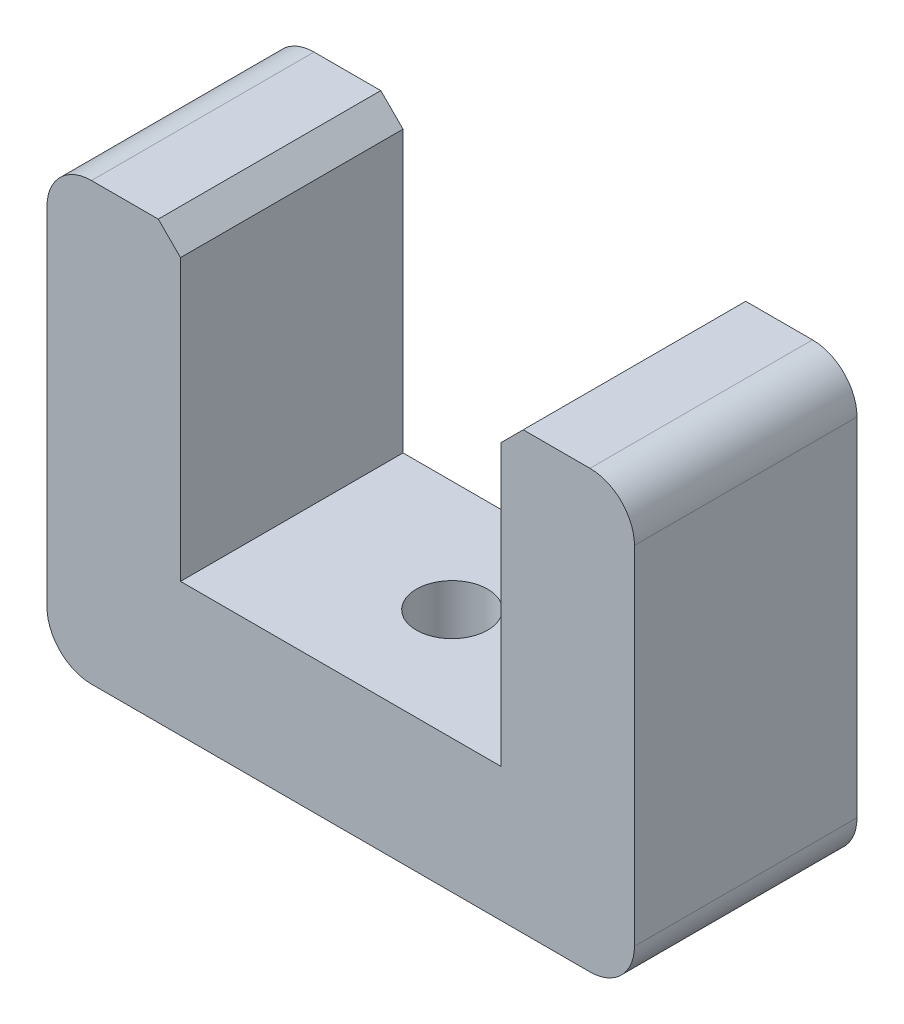
ISO-10303-21;
HEADER;
FILE_DESCRIPTION(('STEP AP214'),'2;1');
FILE_NAME('part.step','',(''),(''),'','','');
FILE_SCHEMA(('AUTOMOTIVE_DESIGN { 1 0 10303 214 1 1 1 1 }'));
ENDSEC;
DATA;
#1=APPLICATION_CONTEXT('core data for automotive mechanical design processes');
#2=APPLICATION_PROTOCOL_DEFINITION('international standard','automotive_design',2000,#1);
#3=PRODUCT_CONTEXT('',#1,'mechanical');
#4=PRODUCT('Part','Part','',(#3));
#5=PRODUCT_RELATED_PRODUCT_CATEGORY('part','',(#4));
#6=PRODUCT_DEFINITION_FORMATION('','',#4);
#7=PRODUCT_DEFINITION_CONTEXT('part definition',#1,'design');
#8=PRODUCT_DEFINITION('design','',#6,#7);
#9=PRODUCT_DEFINITION_SHAPE('','',#8);
#10=(LENGTH_UNIT() NAMED_UNIT(*) SI_UNIT(.MILLI.,.METRE.));
#11=(NAMED_UNIT(*) PLANE_ANGLE_UNIT() SI_UNIT($,.RADIAN.));
#12=(NAMED_UNIT(*) SI_UNIT($,.STERADIAN.) SOLID_ANGLE_UNIT());
#13=UNCERTAINTY_MEASURE_WITH_UNIT(LENGTH_MEASURE(1.E-05),#10,'distance_accuracy_value','');
#14=(GEOMETRIC_REPRESENTATION_CONTEXT(3) GLOBAL_UNCERTAINTY_ASSIGNED_CONTEXT((#13)) GLOBAL_UNIT_ASSIGNED_CONTEXT((#10,
#11,#12)) REPRESENTATION_CONTEXT('',''));
#15=CARTESIAN_POINT('',(0.,0.,0.));
#16=DIRECTION('',(0.,0.,1.));
#17=DIRECTION('',(1.,0.,0.));
#18=AXIS2_PLACEMENT_3D('',#15,#16,#17);
#19=CARTESIAN_POINT('',(-3.6,0.,5.));
#20=DIRECTION('',(0.,-1.,0.));
#21=DIRECTION('',(1.,0.,0.));
#22=AXIS2_PLACEMENT_3D('',#19,#20,#21);
#23=PLANE('',#22);
#24=DIRECTION('',(-1.,0.,0.));
#25=VECTOR('',#24,1.);
#26=CARTESIAN_POINT('',(-3.6,0.,0.));
#27=LINE('',#26,#25);
#28=CARTESIAN_POINT('',(-4.1,0.,0.));
#29=VERTEX_POINT('',#28);
#30=CARTESIAN_POINT('',(-5.6,0.,0.));
#31=VERTEX_POINT('',#30);
#32=EDGE_CURVE('E168',#29,#31,#27,.T.);
#33=ORIENTED_EDGE('',*,*,#32,.T.);
#34=DIRECTION('',(0.,0.,-1.));
#35=VECTOR('',#34,1.);
#36=CARTESIAN_POINT('',(-5.6,0.,5.));
#37=LINE('',#36,#35);
#38=CARTESIAN_POINT('',(-5.6,0.,5.));
#39=VERTEX_POINT('',#38);
#40=EDGE_CURVE('E42',#31,#39,#37,.F.);
#41=ORIENTED_EDGE('',*,*,#40,.T.);
#42=DIRECTION('',(-1.,0.,0.));
#43=VECTOR('',#42,1.);
#44=CARTESIAN_POINT('',(-3.6,0.,5.));
#45=LINE('',#44,#43);
#46=CARTESIAN_POINT('',(-4.1,0.,5.));
#47=VERTEX_POINT('',#46);
#48=EDGE_CURVE('E188',#47,#39,#45,.T.);
#49=ORIENTED_EDGE('',*,*,#48,.F.);
#50=DIRECTION('',(0.,0.,-1.));
#51=VECTOR('',#50,1.);
#52=CARTESIAN_POINT('',(-4.1,0.,5.));
#53=LINE('',#52,#51);
#54=EDGE_CURVE('E157',#47,#29,#53,.T.);
#55=ORIENTED_EDGE('',*,*,#54,.T.);
#56=EDGE_LOOP('',(#33,#41,#49,#55));
#57=FACE_BOUND('',#56,.T.);
#58=ADVANCED_FACE('F34',(#57),#23,.F.);
#59=CARTESIAN_POINT('',(-6.6,0.,5.));
#60=DIRECTION('',(1.,0.,0.));
#61=DIRECTION('',(0.,1.,0.));
#62=AXIS2_PLACEMENT_3D('',#59,#60,#61);
#63=PLANE('',#62);
#64=DIRECTION('',(0.,-1.,0.));
#65=VECTOR('',#64,1.);
#66=CARTESIAN_POINT('',(-6.6,0.,0.));
#67=LINE('',#66,#65);
#68=CARTESIAN_POINT('',(-6.6,-1.,0.));
#69=VERTEX_POINT('',#68);
#70=CARTESIAN_POINT('',(-6.6,-8.8,0.));
#71=VERTEX_POINT('',#70);
#72=EDGE_CURVE('E171',#69,#71,#67,.T.);
#73=ORIENTED_EDGE('',*,*,#72,.T.);
#74=DIRECTION('',(0.,0.,-1.));
#75=VECTOR('',#74,1.);
#76=CARTESIAN_POINT('',(-6.6,-8.8,5.));
#77=LINE('',#76,#75);
#78=CARTESIAN_POINT('',(-6.6,-8.8,5.));
#79=VERTEX_POINT('',#78);
#80=EDGE_CURVE('E223',#71,#79,#77,.F.);
#81=ORIENTED_EDGE('',*,*,#80,.T.);
#82=DIRECTION('',(0.,-1.,0.));
#83=VECTOR('',#82,1.);
#84=CARTESIAN_POINT('',(-6.6,0.,5.));
#85=LINE('',#84,#83);
#86=CARTESIAN_POINT('',(-6.6,-1.,5.));
#87=VERTEX_POINT('',#86);
#88=EDGE_CURVE('E245',#87,#79,#85,.T.);
#89=ORIENTED_EDGE('',*,*,#88,.F.);
#90=DIRECTION('',(0.,0.,-1.));
#91=VECTOR('',#90,1.);
#92=CARTESIAN_POINT('',(-6.6,-1.,5.));
#93=LINE('',#92,#91);
#94=EDGE_CURVE('E220',#87,#69,#93,.T.);
#95=ORIENTED_EDGE('',*,*,#94,.T.);
#96=EDGE_LOOP('',(#73,#81,#89,#95));
#97=FACE_BOUND('',#96,.T.);
#98=ADVANCED_FACE('F251',(#97),#63,.F.);
#99=CARTESIAN_POINT('',(-6.6,-9.8,5.));
#100=DIRECTION('',(0.,1.,0.));
#101=DIRECTION('',(-1.,0.,0.));
#102=AXIS2_PLACEMENT_3D('',#99,#100,#101);
#103=PLANE('',#102);
#104=CARTESIAN_POINT('',(0.,-9.8,2.5));
#105=DIRECTION('',(0.,1.,0.));
#106=DIRECTION('',(-1.,0.,0.));
#107=AXIS2_PLACEMENT_3D('',#104,#105,#106);
#108=CIRCLE('',#107,0.8);
#109=CARTESIAN_POINT('',(-0.799999999999999,-9.8,2.5));
#110=VERTEX_POINT('',#109);
#111=EDGE_CURVE('E172',#110,#110,#108,.T.);
#112=ORIENTED_EDGE('',*,*,#111,.T.);
#113=EDGE_LOOP('',(#112));
#114=FACE_BOUND('',#113,.T.);
#115=DIRECTION('',(1.,0.,0.));
#116=VECTOR('',#115,1.);
#117=CARTESIAN_POINT('',(-6.6,-9.8,5.));
#118=LINE('',#117,#116);
#119=CARTESIAN_POINT('',(-5.6,-9.8,5.));
#120=VERTEX_POINT('',#119);
#121=CARTESIAN_POINT('',(5.6,-9.8,5.));
#122=VERTEX_POINT('',#121);
#123=EDGE_CURVE('E265',#120,#122,#118,.T.);
#124=ORIENTED_EDGE('',*,*,#123,.F.);
#125=DIRECTION('',(0.,0.,-1.));
#126=VECTOR('',#125,1.);
#127=CARTESIAN_POINT('',(-5.6,-9.8,5.));
#128=LINE('',#127,#126);
#129=CARTESIAN_POINT('',(-5.6,-9.8,0.));
#130=VERTEX_POINT('',#129);
#131=EDGE_CURVE('E209',#120,#130,#128,.T.);
#132=ORIENTED_EDGE('',*,*,#131,.T.);
#133=DIRECTION('',(1.,0.,0.));
#134=VECTOR('',#133,1.);
#135=CARTESIAN_POINT('',(-6.6,-9.8,0.));
#136=LINE('',#135,#134);
#137=CARTESIAN_POINT('',(5.6,-9.8,0.));
#138=VERTEX_POINT('',#137);
#139=EDGE_CURVE('E175',#130,#138,#136,.T.);
#140=ORIENTED_EDGE('',*,*,#139,.T.);
#141=DIRECTION('',(0.,0.,-1.));
#142=VECTOR('',#141,1.);
#143=CARTESIAN_POINT('',(5.6,-9.8,5.));
#144=LINE('',#143,#142);
#145=EDGE_CURVE('E207',#138,#122,#144,.F.);
#146=ORIENTED_EDGE('',*,*,#145,.T.);
#147=EDGE_LOOP('',(#124,#132,#140,#146));
#148=FACE_BOUND('',#147,.T.);
#149=ADVANCED_FACE('F262',(#114,#148),#103,.F.);
#150=CARTESIAN_POINT('',(6.6,0.,5.));
#151=DIRECTION('',(-1.,0.,0.));
#152=DIRECTION('',(0.,-1.,0.));
#153=AXIS2_PLACEMENT_3D('',#150,#151,#152);
#154=PLANE('',#153);
#155=DIRECTION('',(0.,1.,0.));
#156=VECTOR('',#155,1.);
#157=CARTESIAN_POINT('',(6.6,0.,5.));
#158=LINE('',#157,#156);
#159=CARTESIAN_POINT('',(6.6,-8.8,5.));
#160=VERTEX_POINT('',#159);
#161=CARTESIAN_POINT('',(6.6,-0.999999999999999,5.));
#162=VERTEX_POINT('',#161);
#163=EDGE_CURVE('E267',#160,#162,#158,.T.);
#164=ORIENTED_EDGE('',*,*,#163,.F.);
#165=DIRECTION('',(0.,0.,-1.));
#166=VECTOR('',#165,1.);
#167=CARTESIAN_POINT('',(6.6,-8.8,5.));
#168=LINE('',#167,#166);
#169=CARTESIAN_POINT('',(6.6,-8.8,0.));
#170=VERTEX_POINT('',#169);
#171=EDGE_CURVE('E233',#160,#170,#168,.T.);
#172=ORIENTED_EDGE('',*,*,#171,.T.);
#173=DIRECTION('',(0.,1.,0.));
#174=VECTOR('',#173,1.);
#175=CARTESIAN_POINT('',(6.6,0.,0.));
#176=LINE('',#175,#174);
#177=CARTESIAN_POINT('',(6.6,-0.999999999999999,0.));
#178=VERTEX_POINT('',#177);
#179=EDGE_CURVE('E178',#170,#178,#176,.T.);
#180=ORIENTED_EDGE('',*,*,#179,.T.);
#181=DIRECTION('',(0.,0.,-1.));
#182=VECTOR('',#181,1.);
#183=CARTESIAN_POINT('',(6.6,-0.999999999999999,5.));
#184=LINE('',#183,#182);
#185=EDGE_CURVE('E57',#178,#162,#184,.F.);
#186=ORIENTED_EDGE('',*,*,#185,.T.);
#187=EDGE_LOOP('',(#164,#172,#180,#186));
#188=FACE_BOUND('',#187,.T.);
#189=ADVANCED_FACE('F301',(#188),#154,.F.);
#190=CARTESIAN_POINT('',(3.6,0.,5.));
#191=DIRECTION('',(0.,-1.,0.));
#192=DIRECTION('',(1.,0.,0.));
#193=AXIS2_PLACEMENT_3D('',#190,#191,#192);
#194=PLANE('',#193);
#195=DIRECTION('',(-1.,0.,0.));
#196=VECTOR('',#195,1.);
#197=CARTESIAN_POINT('',(3.6,0.,5.));
#198=LINE('',#197,#196);
#199=CARTESIAN_POINT('',(5.6,0.,5.));
#200=VERTEX_POINT('',#199);
#201=CARTESIAN_POINT('',(4.1,0.,5.));
#202=VERTEX_POINT('',#201);
#203=EDGE_CURVE('E148',#200,#202,#198,.T.);
#204=ORIENTED_EDGE('',*,*,#203,.F.);
#205=DIRECTION('',(0.,0.,-1.));
#206=VECTOR('',#205,1.);
#207=CARTESIAN_POINT('',(5.6,0.,5.));
#208=LINE('',#207,#206);
#209=CARTESIAN_POINT('',(5.6,0.,0.));
#210=VERTEX_POINT('',#209);
#211=EDGE_CURVE('E11',#200,#210,#208,.T.);
#212=ORIENTED_EDGE('',*,*,#211,.T.);
#213=DIRECTION('',(-1.,0.,0.));
#214=VECTOR('',#213,1.);
#215=CARTESIAN_POINT('',(3.6,0.,0.));
#216=LINE('',#215,#214);
#217=CARTESIAN_POINT('',(4.1,0.,0.));
#218=VERTEX_POINT('',#217);
#219=EDGE_CURVE('E180',#210,#218,#216,.T.);
#220=ORIENTED_EDGE('',*,*,#219,.T.);
#221=DIRECTION('',(0.,0.,1.));
#222=VECTOR('',#221,1.);
#223=CARTESIAN_POINT('',(4.1,0.,5.));
#224=LINE('',#223,#222);
#225=EDGE_CURVE('E204',#218,#202,#224,.T.);
#226=ORIENTED_EDGE('',*,*,#225,.T.);
#227=EDGE_LOOP('',(#204,#212,#220,#226));
#228=FACE_BOUND('',#227,.T.);
#229=ADVANCED_FACE('F274',(#228),#194,.F.);
#230=CARTESIAN_POINT('',(3.6,0.,5.));
#231=DIRECTION('',(1.,0.,0.));
#232=DIRECTION('',(0.,1.,0.));
#233=AXIS2_PLACEMENT_3D('',#230,#231,#232);
#234=PLANE('',#233);
#235=DIRECTION('',(0.,-1.,0.));
#236=VECTOR('',#235,1.);
#237=CARTESIAN_POINT('',(3.6,0.,5.));
#238=LINE('',#237,#236);
#239=CARTESIAN_POINT('',(3.6,-0.499999999999999,5.));
#240=VERTEX_POINT('',#239);
#241=CARTESIAN_POINT('',(3.6,-6.8,5.));
#242=VERTEX_POINT('',#241);
#243=EDGE_CURVE('E135',#240,#242,#238,.T.);
#244=ORIENTED_EDGE('',*,*,#243,.F.);
#245=DIRECTION('',(0.,0.,-1.));
#246=VECTOR('',#245,1.);
#247=CARTESIAN_POINT('',(3.6,-0.499999999999999,5.));
#248=LINE('',#247,#246);
#249=CARTESIAN_POINT('',(3.6,-0.499999999999999,0.));
#250=VERTEX_POINT('',#249);
#251=EDGE_CURVE('E202',#240,#250,#248,.T.);
#252=ORIENTED_EDGE('',*,*,#251,.T.);
#253=DIRECTION('',(0.,-1.,0.));
#254=VECTOR('',#253,1.);
#255=CARTESIAN_POINT('',(3.6,0.,0.));
#256=LINE('',#255,#254);
#257=CARTESIAN_POINT('',(3.6,-6.8,0.));
#258=VERTEX_POINT('',#257);
#259=EDGE_CURVE('E154',#250,#258,#256,.T.);
#260=ORIENTED_EDGE('',*,*,#259,.T.);
#261=DIRECTION('',(0.,0.,-1.));
#262=VECTOR('',#261,1.);
#263=CARTESIAN_POINT('',(3.6,-6.8,5.));
#264=LINE('',#263,#262);
#265=EDGE_CURVE('E151',#242,#258,#264,.T.);
#266=ORIENTED_EDGE('',*,*,#265,.F.);
#267=EDGE_LOOP('',(#244,#252,#260,#266));
#268=FACE_BOUND('',#267,.T.);
#269=ADVANCED_FACE('F152',(#268),#234,.F.);
#270=CARTESIAN_POINT('',(-3.6,-6.8,5.));
#271=DIRECTION('',(0.,-1.,0.));
#272=DIRECTION('',(1.,0.,0.));
#273=AXIS2_PLACEMENT_3D('',#270,#271,#272);
#274=PLANE('',#273);
#275=CARTESIAN_POINT('',(0.,-6.8,2.5));
#276=DIRECTION('',(0.,1.,0.));
#277=DIRECTION('',(-1.,0.,0.));
#278=AXIS2_PLACEMENT_3D('',#275,#276,#277);
#279=CIRCLE('',#278,0.8);
#280=CARTESIAN_POINT('',(-0.799999999999999,-6.8,2.5));
#281=VERTEX_POINT('',#280);
#282=EDGE_CURVE('E326',#281,#281,#279,.T.);
#283=ORIENTED_EDGE('',*,*,#282,.F.);
#284=EDGE_LOOP('',(#283));
#285=FACE_BOUND('',#284,.T.);
#286=DIRECTION('',(-1.,0.,0.));
#287=VECTOR('',#286,1.);
#288=CARTESIAN_POINT('',(-3.6,-6.8,0.));
#289=LINE('',#288,#287);
#290=CARTESIAN_POINT('',(-3.6,-6.8,0.));
#291=VERTEX_POINT('',#290);
#292=EDGE_CURVE('E183',#258,#291,#289,.T.);
#293=ORIENTED_EDGE('',*,*,#292,.T.);
#294=DIRECTION('',(0.,0.,-1.));
#295=VECTOR('',#294,1.);
#296=CARTESIAN_POINT('',(-3.6,-6.8,5.));
#297=LINE('',#296,#295);
#298=CARTESIAN_POINT('',(-3.6,-6.8,5.));
#299=VERTEX_POINT('',#298);
#300=EDGE_CURVE('E158',#299,#291,#297,.T.);
#301=ORIENTED_EDGE('',*,*,#300,.F.);
#302=DIRECTION('',(-1.,0.,0.));
#303=VECTOR('',#302,1.);
#304=CARTESIAN_POINT('',(-3.6,-6.8,5.));
#305=LINE('',#304,#303);
#306=EDGE_CURVE('E141',#242,#299,#305,.T.);
#307=ORIENTED_EDGE('',*,*,#306,.F.);
#308=ORIENTED_EDGE('',*,*,#265,.T.);
#309=EDGE_LOOP('',(#293,#301,#307,#308));
#310=FACE_BOUND('',#309,.T.);
#311=ADVANCED_FACE('F160',(#285,#310),#274,.F.);
#312=CARTESIAN_POINT('',(-3.6,0.,5.));
#313=DIRECTION('',(-1.,0.,0.));
#314=DIRECTION('',(0.,-1.,0.));
#315=AXIS2_PLACEMENT_3D('',#312,#313,#314);
#316=PLANE('',#315);
#317=DIRECTION('',(0.,1.,0.));
#318=VECTOR('',#317,1.);
#319=CARTESIAN_POINT('',(-3.6,0.,0.));
#320=LINE('',#319,#318);
#321=CARTESIAN_POINT('',(-3.6,-0.499999999999999,0.));
#322=VERTEX_POINT('',#321);
#323=EDGE_CURVE('E185',#291,#322,#320,.T.);
#324=ORIENTED_EDGE('',*,*,#323,.T.);
#325=DIRECTION('',(0.,0.,1.));
#326=VECTOR('',#325,1.);
#327=CARTESIAN_POINT('',(-3.6,-0.499999999999999,5.));
#328=LINE('',#327,#326);
#329=CARTESIAN_POINT('',(-3.6,-0.499999999999999,5.));
#330=VERTEX_POINT('',#329);
#331=EDGE_CURVE('E197',#322,#330,#328,.T.);
#332=ORIENTED_EDGE('',*,*,#331,.T.);
#333=DIRECTION('',(0.,1.,0.));
#334=VECTOR('',#333,1.);
#335=CARTESIAN_POINT('',(-3.6,0.,5.));
#336=LINE('',#335,#334);
#337=EDGE_CURVE('E163',#299,#330,#336,.T.);
#338=ORIENTED_EDGE('',*,*,#337,.F.);
#339=ORIENTED_EDGE('',*,*,#300,.T.);
#340=EDGE_LOOP('',(#324,#332,#338,#339));
#341=FACE_BOUND('',#340,.T.);
#342=ADVANCED_FACE('F280',(#341),#316,.F.);
#343=CARTESIAN_POINT('',(0.,0.,5.));
#344=DIRECTION('',(0.,0.,1.));
#345=DIRECTION('',(1.,0.,0.));
#346=AXIS2_PLACEMENT_3D('',#343,#344,#345);
#347=PLANE('',#346);
#348=ORIENTED_EDGE('',*,*,#88,.T.);
#349=CARTESIAN_POINT('',(-5.6,-8.8,5.));
#350=DIRECTION('',(0.,0.,1.));
#351=DIRECTION('',(1.,0.,0.));
#352=AXIS2_PLACEMENT_3D('',#349,#350,#351);
#353=CIRCLE('',#352,1.);
#354=EDGE_CURVE('E230',#79,#120,#353,.T.);
#355=ORIENTED_EDGE('',*,*,#354,.T.);
#356=ORIENTED_EDGE('',*,*,#123,.T.);
#357=CARTESIAN_POINT('',(5.6,-8.8,5.));
#358=DIRECTION('',(0.,0.,1.));
#359=DIRECTION('',(1.,0.,0.));
#360=AXIS2_PLACEMENT_3D('',#357,#358,#359);
#361=CIRCLE('',#360,1.);
#362=EDGE_CURVE('E228',#122,#160,#361,.T.);
#363=ORIENTED_EDGE('',*,*,#362,.T.);
#364=ORIENTED_EDGE('',*,*,#163,.T.);
#365=CARTESIAN_POINT('',(5.6,-0.999999999999999,5.));
#366=DIRECTION('',(0.,0.,1.));
#367=DIRECTION('',(1.,0.,0.));
#368=AXIS2_PLACEMENT_3D('',#365,#366,#367);
#369=CIRCLE('',#368,1.);
#370=EDGE_CURVE('E49',#162,#200,#369,.T.);
#371=ORIENTED_EDGE('',*,*,#370,.T.);
#372=ORIENTED_EDGE('',*,*,#203,.T.);
#373=DIRECTION('',(0.707106781186549,0.707106781186546,0.));
#374=VECTOR('',#373,1.);
#375=CARTESIAN_POINT('',(2.04999999999999,-2.05,5.));
#376=LINE('',#375,#374);
#377=EDGE_CURVE('E144',#202,#240,#376,.F.);
#378=ORIENTED_EDGE('',*,*,#377,.T.);
#379=ORIENTED_EDGE('',*,*,#243,.T.);
#380=ORIENTED_EDGE('',*,*,#306,.T.);
#381=ORIENTED_EDGE('',*,*,#337,.T.);
#382=DIRECTION('',(0.707106781186546,-0.707106781186549,0.));
#383=VECTOR('',#382,1.);
#384=CARTESIAN_POINT('',(-2.05000000000001,-2.05,5.));
#385=LINE('',#384,#383);
#386=EDGE_CURVE('E200',#330,#47,#385,.F.);
#387=ORIENTED_EDGE('',*,*,#386,.T.);
#388=ORIENTED_EDGE('',*,*,#48,.T.);
#389=CARTESIAN_POINT('',(-5.6,-1.,5.));
#390=DIRECTION('',(0.,0.,1.));
#391=DIRECTION('',(1.,0.,0.));
#392=AXIS2_PLACEMENT_3D('',#389,#390,#391);
#393=CIRCLE('',#392,1.);
#394=EDGE_CURVE('E226',#39,#87,#393,.T.);
#395=ORIENTED_EDGE('',*,*,#394,.T.);
#396=EDGE_LOOP('',(#348,#355,#356,#363,#364,#371,#372,#378,#379,#380,#381,#387,#388,#395));
#397=FACE_BOUND('',#396,.T.);
#398=ADVANCED_FACE('F138',(#397),#347,.T.);
#399=CARTESIAN_POINT('',(0.,0.,0.));
#400=DIRECTION('',(0.,0.,1.));
#401=DIRECTION('',(1.,0.,0.));
#402=AXIS2_PLACEMENT_3D('',#399,#400,#401);
#403=PLANE('',#402);
#404=ORIENTED_EDGE('',*,*,#139,.F.);
#405=CARTESIAN_POINT('',(-5.6,-8.8,0.));
#406=DIRECTION('',(0.,0.,1.));
#407=DIRECTION('',(1.,0.,0.));
#408=AXIS2_PLACEMENT_3D('',#405,#406,#407);
#409=CIRCLE('',#408,1.);
#410=EDGE_CURVE('E218',#130,#71,#409,.F.);
#411=ORIENTED_EDGE('',*,*,#410,.T.);
#412=ORIENTED_EDGE('',*,*,#72,.F.);
#413=CARTESIAN_POINT('',(-5.6,-1.,0.));
#414=DIRECTION('',(0.,0.,1.));
#415=DIRECTION('',(1.,0.,0.));
#416=AXIS2_PLACEMENT_3D('',#413,#414,#415);
#417=CIRCLE('',#416,1.);
#418=EDGE_CURVE('E214',#69,#31,#417,.F.);
#419=ORIENTED_EDGE('',*,*,#418,.T.);
#420=ORIENTED_EDGE('',*,*,#32,.F.);
#421=DIRECTION('',(-0.707106781186546,0.707106781186549,0.));
#422=VECTOR('',#421,1.);
#423=CARTESIAN_POINT('',(-4.1,0.,0.));
#424=LINE('',#423,#422);
#425=EDGE_CURVE('E195',#29,#322,#424,.F.);
#426=ORIENTED_EDGE('',*,*,#425,.T.);
#427=ORIENTED_EDGE('',*,*,#323,.F.);
#428=ORIENTED_EDGE('',*,*,#292,.F.);
#429=ORIENTED_EDGE('',*,*,#259,.F.);
#430=DIRECTION('',(-0.707106781186549,-0.707106781186546,0.));
#431=VECTOR('',#430,1.);
#432=CARTESIAN_POINT('',(3.6,-0.499999999999999,0.));
#433=LINE('',#432,#431);
#434=EDGE_CURVE('E192',#250,#218,#433,.F.);
#435=ORIENTED_EDGE('',*,*,#434,.T.);
#436=ORIENTED_EDGE('',*,*,#219,.F.);
#437=CARTESIAN_POINT('',(5.6,-0.999999999999999,0.));
#438=DIRECTION('',(0.,0.,1.));
#439=DIRECTION('',(1.,0.,0.));
#440=AXIS2_PLACEMENT_3D('',#437,#438,#439);
#441=CIRCLE('',#440,1.);
#442=EDGE_CURVE('E212',#210,#178,#441,.F.);
#443=ORIENTED_EDGE('',*,*,#442,.T.);
#444=ORIENTED_EDGE('',*,*,#179,.F.);
#445=CARTESIAN_POINT('',(5.6,-8.8,0.));
#446=DIRECTION('',(0.,0.,1.));
#447=DIRECTION('',(1.,0.,0.));
#448=AXIS2_PLACEMENT_3D('',#445,#446,#447);
#449=CIRCLE('',#448,1.);
#450=EDGE_CURVE('E216',#170,#138,#449,.F.);
#451=ORIENTED_EDGE('',*,*,#450,.T.);
#452=EDGE_LOOP('',(#404,#411,#412,#419,#420,#426,#427,#428,#429,#435,#436,#443,#444,#451));
#453=FACE_BOUND('',#452,.T.);
#454=ADVANCED_FACE('F255',(#453),#403,.F.);
#455=CARTESIAN_POINT('',(-4.1,0.,5.));
#456=DIRECTION('',(-0.707106781186549,-0.707106781186546,0.));
#457=DIRECTION('',(0.,0.,-1.));
#458=AXIS2_PLACEMENT_3D('',#455,#456,#457);
#459=PLANE('',#458);
#460=ORIENTED_EDGE('',*,*,#386,.F.);
#461=ORIENTED_EDGE('',*,*,#331,.F.);
#462=ORIENTED_EDGE('',*,*,#425,.F.);
#463=ORIENTED_EDGE('',*,*,#54,.F.);
#464=EDGE_LOOP('',(#460,#461,#462,#463));
#465=FACE_BOUND('',#464,.T.);
#466=ADVANCED_FACE('F283',(#465),#459,.F.);
#467=CARTESIAN_POINT('',(3.6,-0.499999999999999,5.));
#468=DIRECTION('',(0.707106781186546,-0.707106781186549,0.));
#469=DIRECTION('',(0.,0.,-1.));
#470=AXIS2_PLACEMENT_3D('',#467,#468,#469);
#471=PLANE('',#470);
#472=ORIENTED_EDGE('',*,*,#377,.F.);
#473=ORIENTED_EDGE('',*,*,#225,.F.);
#474=ORIENTED_EDGE('',*,*,#434,.F.);
#475=ORIENTED_EDGE('',*,*,#251,.F.);
#476=EDGE_LOOP('',(#472,#473,#474,#475));
#477=FACE_BOUND('',#476,.T.);
#478=ADVANCED_FACE('F277',(#477),#471,.F.);
#479=CARTESIAN_POINT('',(-5.6,-8.8,5.));
#480=DIRECTION('',(0.,0.,-1.));
#481=DIRECTION('',(-1.,0.,0.));
#482=AXIS2_PLACEMENT_3D('',#479,#480,#481);
#483=CYLINDRICAL_SURFACE('',#482,1.);
#484=ORIENTED_EDGE('',*,*,#354,.F.);
#485=ORIENTED_EDGE('',*,*,#80,.F.);
#486=ORIENTED_EDGE('',*,*,#410,.F.);
#487=ORIENTED_EDGE('',*,*,#131,.F.);
#488=EDGE_LOOP('',(#484,#485,#486,#487));
#489=FACE_BOUND('',#488,.T.);
#490=ADVANCED_FACE('F259',(#489),#483,.T.);
#491=CARTESIAN_POINT('',(5.6,-8.8,5.));
#492=DIRECTION('',(0.,0.,-1.));
#493=DIRECTION('',(-1.,0.,0.));
#494=AXIS2_PLACEMENT_3D('',#491,#492,#493);
#495=CYLINDRICAL_SURFACE('',#494,1.);
#496=ORIENTED_EDGE('',*,*,#362,.F.);
#497=ORIENTED_EDGE('',*,*,#145,.F.);
#498=ORIENTED_EDGE('',*,*,#450,.F.);
#499=ORIENTED_EDGE('',*,*,#171,.F.);
#500=EDGE_LOOP('',(#496,#497,#498,#499));
#501=FACE_BOUND('',#500,.T.);
#502=ADVANCED_FACE('F334',(#501),#495,.T.);
#503=CARTESIAN_POINT('',(-5.6,-1.,5.));
#504=DIRECTION('',(0.,0.,-1.));
#505=DIRECTION('',(-1.,0.,0.));
#506=AXIS2_PLACEMENT_3D('',#503,#504,#505);
#507=CYLINDRICAL_SURFACE('',#506,1.);
#508=ORIENTED_EDGE('',*,*,#394,.F.);
#509=ORIENTED_EDGE('',*,*,#40,.F.);
#510=ORIENTED_EDGE('',*,*,#418,.F.);
#511=ORIENTED_EDGE('',*,*,#94,.F.);
#512=EDGE_LOOP('',(#508,#509,#510,#511));
#513=FACE_BOUND('',#512,.T.);
#514=ADVANCED_FACE('F248',(#513),#507,.T.);
#515=CARTESIAN_POINT('',(5.6,-0.999999999999999,5.));
#516=DIRECTION('',(0.,0.,-1.));
#517=DIRECTION('',(-1.,0.,0.));
#518=AXIS2_PLACEMENT_3D('',#515,#516,#517);
#519=CYLINDRICAL_SURFACE('',#518,1.);
#520=ORIENTED_EDGE('',*,*,#370,.F.);
#521=ORIENTED_EDGE('',*,*,#185,.F.);
#522=ORIENTED_EDGE('',*,*,#442,.F.);
#523=ORIENTED_EDGE('',*,*,#211,.F.);
#524=EDGE_LOOP('',(#520,#521,#522,#523));
#525=FACE_BOUND('',#524,.T.);
#526=ADVANCED_FACE('F36',(#525),#519,.T.);
#527=CARTESIAN_POINT('',(0.,-10.8,2.5));
#528=DIRECTION('',(0.,1.,0.));
#529=DIRECTION('',(-1.,0.,0.));
#530=AXIS2_PLACEMENT_3D('',#527,#528,#529);
#531=CYLINDRICAL_SURFACE('',#530,0.8);
#532=ORIENTED_EDGE('',*,*,#282,.T.);
#533=EDGE_LOOP('',(#532));
#534=FACE_BOUND('',#533,.T.);
#535=ORIENTED_EDGE('',*,*,#111,.F.);
#536=EDGE_LOOP('',(#535));
#537=FACE_BOUND('',#536,.T.);
#538=ADVANCED_FACE('F316',(#534,#537),#531,.F.);
#539=CLOSED_SHELL('',(#58,#98,#149,#189,#229,#269,#311,#342,#398,#454,#466,#478,#490,#502,#514,
#526,#538));
#540=MANIFOLD_SOLID_BREP('B2',#539);
#541=ADVANCED_BREP_SHAPE_REPRESENTATION('',(#18,#540),#14);
#542=SHAPE_DEFINITION_REPRESENTATION(#9,#541);
ENDSEC;
END-ISO-10303-21;
